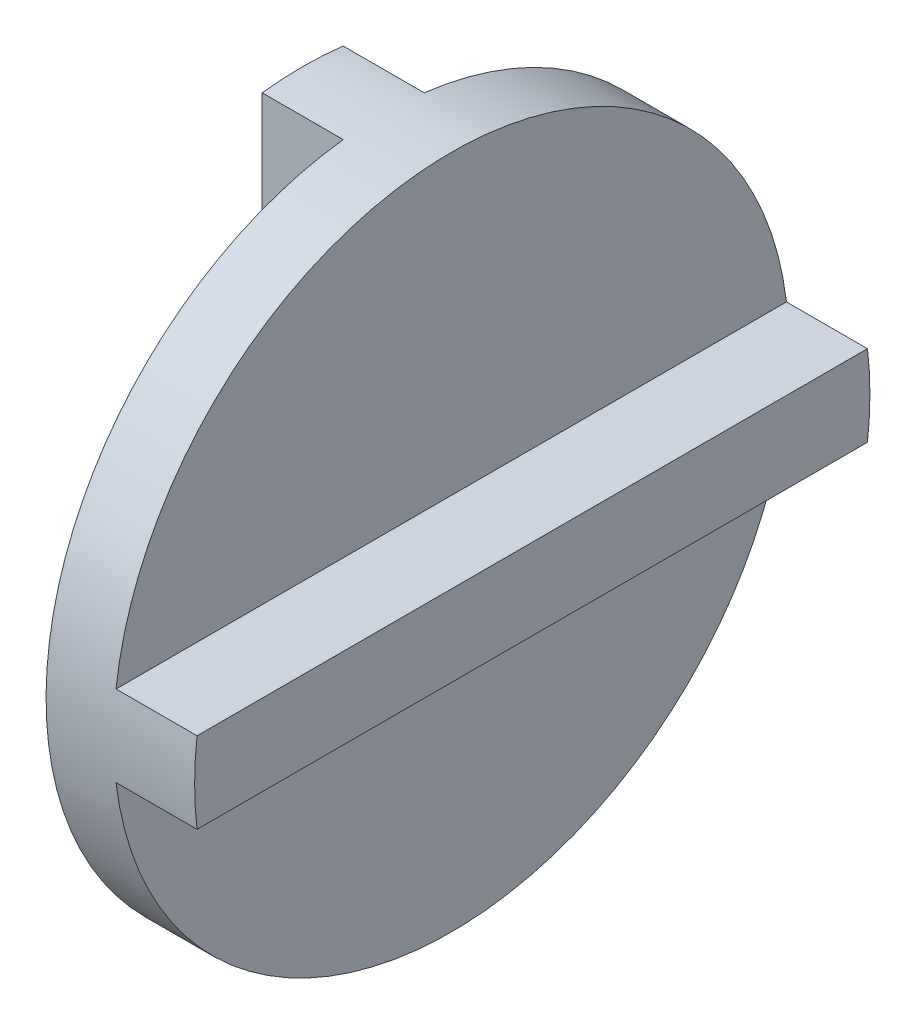
ISO-10303-21;
HEADER;
FILE_DESCRIPTION(('STEP AP214'),'2;1');
FILE_NAME('part.step','',(''),(''),'','','');
FILE_SCHEMA(('AUTOMOTIVE_DESIGN { 1 0 10303 214 1 1 1 1 }'));
ENDSEC;
DATA;
#1=APPLICATION_CONTEXT('core data for automotive mechanical design processes');
#2=APPLICATION_PROTOCOL_DEFINITION('international standard','automotive_design',2000,#1);
#3=PRODUCT_CONTEXT('',#1,'mechanical');
#4=PRODUCT('Part','Part','',(#3));
#5=PRODUCT_RELATED_PRODUCT_CATEGORY('part','',(#4));
#6=PRODUCT_DEFINITION_FORMATION('','',#4);
#7=PRODUCT_DEFINITION_CONTEXT('part definition',#1,'design');
#8=PRODUCT_DEFINITION('design','',#6,#7);
#9=PRODUCT_DEFINITION_SHAPE('','',#8);
#10=(LENGTH_UNIT() NAMED_UNIT(*) SI_UNIT(.MILLI.,.METRE.));
#11=(NAMED_UNIT(*) PLANE_ANGLE_UNIT() SI_UNIT($,.RADIAN.));
#12=(NAMED_UNIT(*) SI_UNIT($,.STERADIAN.) SOLID_ANGLE_UNIT());
#13=UNCERTAINTY_MEASURE_WITH_UNIT(LENGTH_MEASURE(1.E-05),#10,'distance_accuracy_value','');
#14=(GEOMETRIC_REPRESENTATION_CONTEXT(3) GLOBAL_UNCERTAINTY_ASSIGNED_CONTEXT((#13)) GLOBAL_UNIT_ASSIGNED_CONTEXT((#10,
#11,#12)) REPRESENTATION_CONTEXT('',''));
#15=CARTESIAN_POINT('',(0.,0.,0.));
#16=DIRECTION('',(0.,0.,1.));
#17=DIRECTION('',(1.,0.,0.));
#18=AXIS2_PLACEMENT_3D('',#15,#16,#17);
#19=CARTESIAN_POINT('',(0.,0.,0.));
#20=DIRECTION('',(1.,0.,0.));
#21=DIRECTION('',(0.,0.,-1.));
#22=AXIS2_PLACEMENT_3D('',#19,#20,#21);
#23=PLANE('',#22);
#24=DIRECTION('',(0.,-1.,0.));
#25=VECTOR('',#24,1.);
#26=CARTESIAN_POINT('',(0.,0.,-6.));
#27=LINE('',#26,#25);
#28=CARTESIAN_POINT('',(0.,49.6386945839634,-6.00000000000001));
#29=VERTEX_POINT('',#28);
#30=CARTESIAN_POINT('',(0.,-49.6386945839634,-5.99999999999999));
#31=VERTEX_POINT('',#30);
#32=EDGE_CURVE('E129',#29,#31,#27,.T.);
#33=ORIENTED_EDGE('',*,*,#32,.F.);
#34=CARTESIAN_POINT('',(0.,0.,0.));
#35=DIRECTION('',(1.,0.,0.));
#36=DIRECTION('',(0.,0.,-1.));
#37=AXIS2_PLACEMENT_3D('',#34,#35,#36);
#38=CIRCLE('',#37,50.);
#39=EDGE_CURVE('E45',#31,#29,#38,.T.);
#40=ORIENTED_EDGE('',*,*,#39,.F.);
#41=EDGE_LOOP('',(#33,#40));
#42=FACE_BOUND('',#41,.T.);
#43=ADVANCED_FACE('F41',(#42),#23,.F.);
#44=CARTESIAN_POINT('',(10.,0.,0.));
#45=DIRECTION('',(1.,0.,0.));
#46=DIRECTION('',(0.,0.,-1.));
#47=AXIS2_PLACEMENT_3D('',#44,#45,#46);
#48=PLANE('',#47);
#49=DIRECTION('',(0.,0.,1.));
#50=VECTOR('',#49,1.);
#51=CARTESIAN_POINT('',(10.,6.,49.6386945839634));
#52=LINE('',#51,#50);
#53=CARTESIAN_POINT('',(10.,6.,-49.6386945839634));
#54=VERTEX_POINT('',#53);
#55=CARTESIAN_POINT('',(10.,6.,49.6386945839634));
#56=VERTEX_POINT('',#55);
#57=EDGE_CURVE('E153',#54,#56,#52,.T.);
#58=ORIENTED_EDGE('',*,*,#57,.F.);
#59=CARTESIAN_POINT('',(10.,0.,0.));
#60=DIRECTION('',(1.,0.,0.));
#61=DIRECTION('',(0.,0.,-1.));
#62=AXIS2_PLACEMENT_3D('',#59,#60,#61);
#63=CIRCLE('',#62,50.);
#64=EDGE_CURVE('E11',#54,#56,#63,.T.);
#65=ORIENTED_EDGE('',*,*,#64,.T.);
#66=EDGE_LOOP('',(#58,#65));
#67=FACE_BOUND('',#66,.T.);
#68=ADVANCED_FACE('F205',(#67),#48,.T.);
#69=CARTESIAN_POINT('',(10.,0.,0.));
#70=DIRECTION('',(-1.,0.,0.));
#71=DIRECTION('',(0.,0.,1.));
#72=AXIS2_PLACEMENT_3D('',#69,#70,#71);
#73=CYLINDRICAL_SURFACE('',#72,50.);
#74=ORIENTED_EDGE('',*,*,#64,.F.);
#75=DIRECTION('',(-1.,0.,0.));
#76=VECTOR('',#75,1.);
#77=CARTESIAN_POINT('',(22.,6.,-49.6386945839634));
#78=LINE('',#77,#76);
#79=CARTESIAN_POINT('',(22.,6.,-49.6386945839634));
#80=VERTEX_POINT('',#79);
#81=EDGE_CURVE('E172',#80,#54,#78,.T.);
#82=ORIENTED_EDGE('',*,*,#81,.F.);
#83=CARTESIAN_POINT('',(22.,0.,0.));
#84=DIRECTION('',(1.,0.,0.));
#85=DIRECTION('',(0.,0.,-1.));
#86=AXIS2_PLACEMENT_3D('',#83,#84,#85);
#87=CIRCLE('',#86,50.);
#88=CARTESIAN_POINT('',(22.,-6.00000000000001,-49.6386945839634));
#89=VERTEX_POINT('',#88);
#90=EDGE_CURVE('E156',#89,#80,#87,.T.);
#91=ORIENTED_EDGE('',*,*,#90,.F.);
#92=DIRECTION('',(-1.,0.,0.));
#93=VECTOR('',#92,1.);
#94=CARTESIAN_POINT('',(22.,-6.00000000000001,-49.6386945839634));
#95=LINE('',#94,#93);
#96=CARTESIAN_POINT('',(10.,-6.00000000000001,-49.6386945839634));
#97=VERTEX_POINT('',#96);
#98=EDGE_CURVE('E176',#89,#97,#95,.T.);
#99=ORIENTED_EDGE('',*,*,#98,.T.);
#100=CARTESIAN_POINT('',(10.,-6.,49.6386945839634));
#101=VERTEX_POINT('',#100);
#102=EDGE_CURVE('E51',#101,#97,#63,.T.);
#103=ORIENTED_EDGE('',*,*,#102,.F.);
#104=DIRECTION('',(-1.,0.,0.));
#105=VECTOR('',#104,1.);
#106=CARTESIAN_POINT('',(22.,-6.,49.6386945839634));
#107=LINE('',#106,#105);
#108=CARTESIAN_POINT('',(22.,-6.,49.6386945839634));
#109=VERTEX_POINT('',#108);
#110=EDGE_CURVE('E180',#109,#101,#107,.T.);
#111=ORIENTED_EDGE('',*,*,#110,.F.);
#112=CARTESIAN_POINT('',(22.,0.,0.));
#113=DIRECTION('',(1.,0.,0.));
#114=DIRECTION('',(0.,0.,-1.));
#115=AXIS2_PLACEMENT_3D('',#112,#113,#114);
#116=CIRCLE('',#115,50.);
#117=CARTESIAN_POINT('',(22.,6.,49.6386945839634));
#118=VERTEX_POINT('',#117);
#119=EDGE_CURVE('E148',#118,#109,#116,.T.);
#120=ORIENTED_EDGE('',*,*,#119,.F.);
#121=DIRECTION('',(-1.,0.,0.));
#122=VECTOR('',#121,1.);
#123=CARTESIAN_POINT('',(22.,6.,49.6386945839634));
#124=LINE('',#123,#122);
#125=EDGE_CURVE('E162',#118,#56,#124,.T.);
#126=ORIENTED_EDGE('',*,*,#125,.T.);
#127=EDGE_LOOP('',(#74,#82,#91,#99,#103,#111,#120,#126));
#128=FACE_BOUND('',#127,.T.);
#129=ORIENTED_EDGE('',*,*,#39,.T.);
#130=DIRECTION('',(1.,0.,0.));
#131=VECTOR('',#130,1.);
#132=CARTESIAN_POINT('',(-12.,49.6386945839634,-6.00000000000001));
#133=LINE('',#132,#131);
#134=CARTESIAN_POINT('',(-12.,49.6386945839634,-6.00000000000001));
#135=VERTEX_POINT('',#134);
#136=EDGE_CURVE('E113',#135,#29,#133,.T.);
#137=ORIENTED_EDGE('',*,*,#136,.F.);
#138=CARTESIAN_POINT('',(-12.,0.,0.));
#139=DIRECTION('',(-1.,0.,0.));
#140=DIRECTION('',(0.,0.,1.));
#141=AXIS2_PLACEMENT_3D('',#138,#139,#140);
#142=CIRCLE('',#141,50.);
#143=CARTESIAN_POINT('',(-12.,49.6386945839634,6.));
#144=VERTEX_POINT('',#143);
#145=EDGE_CURVE('E116',#144,#135,#142,.T.);
#146=ORIENTED_EDGE('',*,*,#145,.F.);
#147=DIRECTION('',(1.,0.,0.));
#148=VECTOR('',#147,1.);
#149=CARTESIAN_POINT('',(-12.,49.6386945839634,6.));
#150=LINE('',#149,#148);
#151=CARTESIAN_POINT('',(0.,49.6386945839634,6.));
#152=VERTEX_POINT('',#151);
#153=EDGE_CURVE('E104',#144,#152,#150,.T.);
#154=ORIENTED_EDGE('',*,*,#153,.T.);
#155=CARTESIAN_POINT('',(0.,-49.6386945839634,6.00000000000001));
#156=VERTEX_POINT('',#155);
#157=EDGE_CURVE('E60',#152,#156,#38,.T.);
#158=ORIENTED_EDGE('',*,*,#157,.T.);
#159=DIRECTION('',(1.,0.,0.));
#160=VECTOR('',#159,1.);
#161=CARTESIAN_POINT('',(-12.,-49.6386945839634,6.00000000000001));
#162=LINE('',#161,#160);
#163=CARTESIAN_POINT('',(-12.,-49.6386945839634,6.00000000000001));
#164=VERTEX_POINT('',#163);
#165=EDGE_CURVE('E139',#164,#156,#162,.T.);
#166=ORIENTED_EDGE('',*,*,#165,.F.);
#167=CARTESIAN_POINT('',(-12.,-49.6386945839634,-5.99999999999999));
#168=VERTEX_POINT('',#167);
#169=EDGE_CURVE('E124',#168,#164,#142,.T.);
#170=ORIENTED_EDGE('',*,*,#169,.F.);
#171=DIRECTION('',(1.,0.,0.));
#172=VECTOR('',#171,1.);
#173=CARTESIAN_POINT('',(-12.,-49.6386945839634,-5.99999999999999));
#174=LINE('',#173,#172);
#175=EDGE_CURVE('E142',#168,#31,#174,.T.);
#176=ORIENTED_EDGE('',*,*,#175,.T.);
#177=EDGE_LOOP('',(#129,#137,#146,#154,#158,#166,#170,#176));
#178=FACE_BOUND('',#177,.T.);
#179=ADVANCED_FACE('F43',(#128,#178),#73,.T.);
#180=DIRECTION('',(0.,0.,-1.));
#181=VECTOR('',#180,1.);
#182=CARTESIAN_POINT('',(10.,-6.,49.6386945839634));
#183=LINE('',#182,#181);
#184=EDGE_CURVE('E112',#101,#97,#183,.T.);
#185=ORIENTED_EDGE('',*,*,#184,.F.);
#186=ORIENTED_EDGE('',*,*,#102,.T.);
#187=EDGE_LOOP('',(#185,#186));
#188=FACE_BOUND('',#187,.T.);
#189=ADVANCED_FACE('F190',(#188),#48,.T.);
#190=ORIENTED_EDGE('',*,*,#157,.F.);
#191=DIRECTION('',(0.,-1.,0.));
#192=VECTOR('',#191,1.);
#193=CARTESIAN_POINT('',(0.,0.,6.));
#194=LINE('',#193,#192);
#195=EDGE_CURVE('E57',#152,#156,#194,.T.);
#196=ORIENTED_EDGE('',*,*,#195,.T.);
#197=EDGE_LOOP('',(#190,#196));
#198=FACE_BOUND('',#197,.T.);
#199=ADVANCED_FACE('F213',(#198),#23,.F.);
#200=CARTESIAN_POINT('',(22.,-6.,49.6386945839634));
#201=DIRECTION('',(0.,1.,0.));
#202=DIRECTION('',(0.,0.,1.));
#203=AXIS2_PLACEMENT_3D('',#200,#201,#202);
#204=PLANE('',#203);
#205=ORIENTED_EDGE('',*,*,#184,.T.);
#206=ORIENTED_EDGE('',*,*,#98,.F.);
#207=DIRECTION('',(0.,0.,-1.));
#208=VECTOR('',#207,1.);
#209=CARTESIAN_POINT('',(22.,-6.,49.6386945839634));
#210=LINE('',#209,#208);
#211=EDGE_CURVE('E152',#109,#89,#210,.T.);
#212=ORIENTED_EDGE('',*,*,#211,.F.);
#213=ORIENTED_EDGE('',*,*,#110,.T.);
#214=EDGE_LOOP('',(#205,#206,#212,#213));
#215=FACE_BOUND('',#214,.T.);
#216=ADVANCED_FACE('F193',(#215),#204,.F.);
#217=CARTESIAN_POINT('',(22.,6.,49.6386945839634));
#218=DIRECTION('',(0.,-1.,0.));
#219=DIRECTION('',(0.,0.,-1.));
#220=AXIS2_PLACEMENT_3D('',#217,#218,#219);
#221=PLANE('',#220);
#222=ORIENTED_EDGE('',*,*,#57,.T.);
#223=ORIENTED_EDGE('',*,*,#125,.F.);
#224=DIRECTION('',(0.,0.,1.));
#225=VECTOR('',#224,1.);
#226=CARTESIAN_POINT('',(22.,6.,49.6386945839634));
#227=LINE('',#226,#225);
#228=EDGE_CURVE('E159',#80,#118,#227,.T.);
#229=ORIENTED_EDGE('',*,*,#228,.F.);
#230=ORIENTED_EDGE('',*,*,#81,.T.);
#231=EDGE_LOOP('',(#222,#223,#229,#230));
#232=FACE_BOUND('',#231,.T.);
#233=ADVANCED_FACE('F203',(#232),#221,.F.);
#234=CARTESIAN_POINT('',(22.,0.,0.));
#235=DIRECTION('',(1.,0.,0.));
#236=DIRECTION('',(0.,0.,-1.));
#237=AXIS2_PLACEMENT_3D('',#234,#235,#236);
#238=PLANE('',#237);
#239=ORIENTED_EDGE('',*,*,#119,.T.);
#240=ORIENTED_EDGE('',*,*,#211,.T.);
#241=ORIENTED_EDGE('',*,*,#90,.T.);
#242=ORIENTED_EDGE('',*,*,#228,.T.);
#243=EDGE_LOOP('',(#239,#240,#241,#242));
#244=FACE_BOUND('',#243,.T.);
#245=ADVANCED_FACE('F199',(#244),#238,.T.);
#246=CARTESIAN_POINT('',(-12.,0.,6.));
#247=DIRECTION('',(0.,0.,1.));
#248=DIRECTION('',(0.,-1.,0.));
#249=AXIS2_PLACEMENT_3D('',#246,#247,#248);
#250=PLANE('',#249);
#251=ORIENTED_EDGE('',*,*,#195,.F.);
#252=ORIENTED_EDGE('',*,*,#153,.F.);
#253=DIRECTION('',(0.,-1.,0.));
#254=VECTOR('',#253,1.);
#255=CARTESIAN_POINT('',(-12.,0.,6.));
#256=LINE('',#255,#254);
#257=EDGE_CURVE('E109',#144,#164,#256,.T.);
#258=ORIENTED_EDGE('',*,*,#257,.T.);
#259=ORIENTED_EDGE('',*,*,#165,.T.);
#260=EDGE_LOOP('',(#251,#252,#258,#259));
#261=FACE_BOUND('',#260,.T.);
#262=ADVANCED_FACE('F106',(#261),#250,.T.);
#263=CARTESIAN_POINT('',(-12.,0.,-6.));
#264=DIRECTION('',(0.,0.,1.));
#265=DIRECTION('',(0.,-1.,0.));
#266=AXIS2_PLACEMENT_3D('',#263,#264,#265);
#267=PLANE('',#266);
#268=ORIENTED_EDGE('',*,*,#32,.T.);
#269=ORIENTED_EDGE('',*,*,#175,.F.);
#270=DIRECTION('',(0.,-1.,0.));
#271=VECTOR('',#270,1.);
#272=CARTESIAN_POINT('',(-12.,0.,-6.));
#273=LINE('',#272,#271);
#274=EDGE_CURVE('E122',#135,#168,#273,.T.);
#275=ORIENTED_EDGE('',*,*,#274,.F.);
#276=ORIENTED_EDGE('',*,*,#136,.T.);
#277=EDGE_LOOP('',(#268,#269,#275,#276));
#278=FACE_BOUND('',#277,.T.);
#279=ADVANCED_FACE('F231',(#278),#267,.F.);
#280=CARTESIAN_POINT('',(-12.,0.,0.));
#281=DIRECTION('',(-1.,0.,0.));
#282=DIRECTION('',(0.,0.,1.));
#283=AXIS2_PLACEMENT_3D('',#280,#281,#282);
#284=PLANE('',#283);
#285=ORIENTED_EDGE('',*,*,#257,.F.);
#286=ORIENTED_EDGE('',*,*,#145,.T.);
#287=ORIENTED_EDGE('',*,*,#274,.T.);
#288=ORIENTED_EDGE('',*,*,#169,.T.);
#289=EDGE_LOOP('',(#285,#286,#287,#288));
#290=FACE_BOUND('',#289,.T.);
#291=ADVANCED_FACE('F125',(#290),#284,.T.);
#292=CLOSED_SHELL('',(#43,#68,#179,#189,#199,#216,#233,#245,#262,#279,#291));
#293=MANIFOLD_SOLID_BREP('B2',#292);
#294=ADVANCED_BREP_SHAPE_REPRESENTATION('',(#18,#293),#14);
#295=SHAPE_DEFINITION_REPRESENTATION(#9,#294);
ENDSEC;
END-ISO-10303-21;
